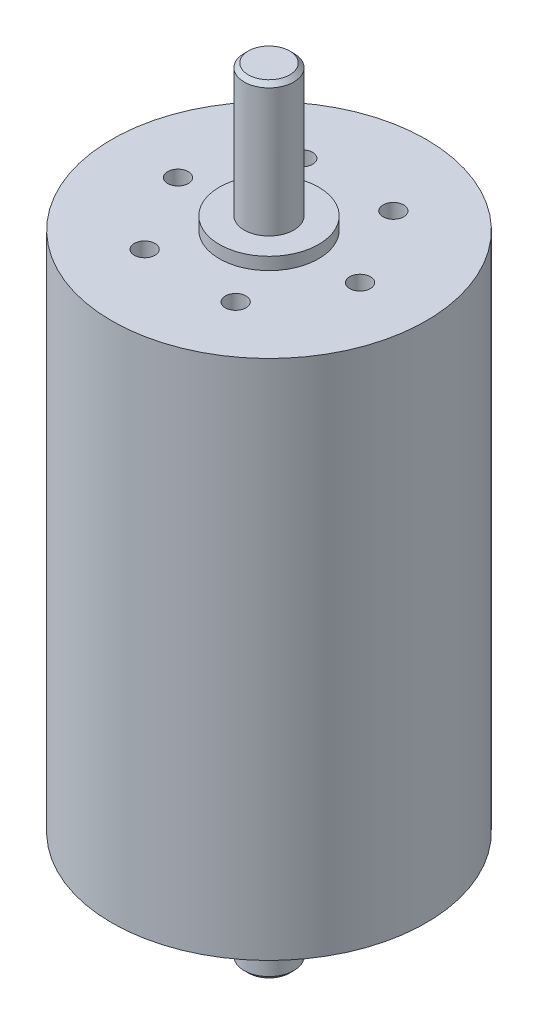
ISO-10303-21;
HEADER;
FILE_DESCRIPTION(('STEP AP214'),'2;1');
FILE_NAME('part.step','',(''),(''),'','','');
FILE_SCHEMA(('AUTOMOTIVE_DESIGN { 1 0 10303 214 1 1 1 1 }'));
ENDSEC;
DATA;
#1=APPLICATION_CONTEXT('core data for automotive mechanical design processes');
#2=APPLICATION_PROTOCOL_DEFINITION('international standard','automotive_design',2000,#1);
#3=PRODUCT_CONTEXT('',#1,'mechanical');
#4=PRODUCT('Part','Part','',(#3));
#5=PRODUCT_RELATED_PRODUCT_CATEGORY('part','',(#4));
#6=PRODUCT_DEFINITION_FORMATION('','',#4);
#7=PRODUCT_DEFINITION_CONTEXT('part definition',#1,'design');
#8=PRODUCT_DEFINITION('design','',#6,#7);
#9=PRODUCT_DEFINITION_SHAPE('','',#8);
#10=(LENGTH_UNIT() NAMED_UNIT(*) SI_UNIT(.MILLI.,.METRE.));
#11=(NAMED_UNIT(*) PLANE_ANGLE_UNIT() SI_UNIT($,.RADIAN.));
#12=(NAMED_UNIT(*) SI_UNIT($,.STERADIAN.) SOLID_ANGLE_UNIT());
#13=UNCERTAINTY_MEASURE_WITH_UNIT(LENGTH_MEASURE(1.E-05),#10,'distance_accuracy_value','');
#14=(GEOMETRIC_REPRESENTATION_CONTEXT(3) GLOBAL_UNCERTAINTY_ASSIGNED_CONTEXT((#13)) GLOBAL_UNIT_ASSIGNED_CONTEXT((#10,
#11,#12)) REPRESENTATION_CONTEXT('',''));
#15=CARTESIAN_POINT('',(0.,0.,0.));
#16=DIRECTION('',(0.,0.,1.));
#17=DIRECTION('',(1.,0.,0.));
#18=AXIS2_PLACEMENT_3D('',#15,#16,#17);
#19=CARTESIAN_POINT('',(3.,0.,0.));
#20=DIRECTION('',(0.,-1.,0.));
#21=DIRECTION('',(0.,0.,-1.));
#22=AXIS2_PLACEMENT_3D('',#19,#20,#21);
#23=PLANE('',#22);
#24=CARTESIAN_POINT('',(0.,0.,0.));
#25=DIRECTION('',(0.,-1.,0.));
#26=DIRECTION('',(0.,0.,-1.));
#27=AXIS2_PLACEMENT_3D('',#24,#25,#26);
#28=CIRCLE('',#27,2.5);
#29=CARTESIAN_POINT('',(0.,0.,-2.5));
#30=VERTEX_POINT('',#29);
#31=EDGE_CURVE('E40',#30,#30,#28,.T.);
#32=ORIENTED_EDGE('',*,*,#31,.T.);
#33=EDGE_LOOP('',(#32));
#34=FACE_BOUND('',#33,.T.);
#35=ADVANCED_FACE('F33',(#34),#23,.T.);
#36=CARTESIAN_POINT('',(0.,94.,0.));
#37=DIRECTION('',(0.,1.,0.));
#38=DIRECTION('',(0.,0.,1.));
#39=AXIS2_PLACEMENT_3D('',#36,#37,#38);
#40=PLANE('',#39);
#41=CARTESIAN_POINT('',(0.,94.,0.));
#42=DIRECTION('',(0.,1.,0.));
#43=DIRECTION('',(0.,0.,1.));
#44=AXIS2_PLACEMENT_3D('',#41,#42,#43);
#45=CIRCLE('',#44,2.49999999999996);
#46=CARTESIAN_POINT('',(0.,94.,2.49999999999996));
#47=VERTEX_POINT('',#46);
#48=EDGE_CURVE('E44',#47,#47,#45,.T.);
#49=ORIENTED_EDGE('',*,*,#48,.T.);
#50=EDGE_LOOP('',(#49));
#51=FACE_BOUND('',#50,.T.);
#52=ADVANCED_FACE('F215',(#51),#40,.T.);
#53=CARTESIAN_POINT('',(0.,0.,0.));
#54=DIRECTION('',(0.,-1.,0.));
#55=DIRECTION('',(0.,0.,-1.));
#56=AXIS2_PLACEMENT_3D('',#53,#54,#55);
#57=CYLINDRICAL_SURFACE('',#56,2.99999999999999);
#58=CARTESIAN_POINT('',(0.,93.5,0.));
#59=DIRECTION('',(0.,1.,0.));
#60=DIRECTION('',(0.,0.,1.));
#61=AXIS2_PLACEMENT_3D('',#58,#59,#60);
#62=CIRCLE('',#61,2.99999999999999);
#63=CARTESIAN_POINT('',(0.,93.5,2.99999999999999));
#64=VERTEX_POINT('',#63);
#65=EDGE_CURVE('E48',#64,#64,#62,.F.);
#66=ORIENTED_EDGE('',*,*,#65,.T.);
#67=EDGE_LOOP('',(#66));
#68=FACE_BOUND('',#67,.T.);
#69=CARTESIAN_POINT('',(0.,78.,0.));
#70=DIRECTION('',(0.,-1.,0.));
#71=DIRECTION('',(0.,0.,-1.));
#72=AXIS2_PLACEMENT_3D('',#69,#70,#71);
#73=CIRCLE('',#72,2.99999999999999);
#74=CARTESIAN_POINT('',(0.,78.,-2.99999999999999));
#75=VERTEX_POINT('',#74);
#76=EDGE_CURVE('E53',#75,#75,#73,.T.);
#77=ORIENTED_EDGE('',*,*,#76,.F.);
#78=EDGE_LOOP('',(#77));
#79=FACE_BOUND('',#78,.T.);
#80=ADVANCED_FACE('F220',(#68,#79),#57,.T.);
#81=CARTESIAN_POINT('',(2.99999999999999,78.,0.));
#82=DIRECTION('',(0.,1.,0.));
#83=DIRECTION('',(0.,0.,1.));
#84=AXIS2_PLACEMENT_3D('',#81,#82,#83);
#85=PLANE('',#84);
#86=ORIENTED_EDGE('',*,*,#76,.T.);
#87=EDGE_LOOP('',(#86));
#88=FACE_BOUND('',#87,.T.);
#89=CARTESIAN_POINT('',(0.,78.,0.));
#90=DIRECTION('',(0.,-1.,0.));
#91=DIRECTION('',(0.,0.,-1.));
#92=AXIS2_PLACEMENT_3D('',#89,#90,#91);
#93=CIRCLE('',#92,5.99999999999999);
#94=CARTESIAN_POINT('',(0.,78.,-5.99999999999999));
#95=VERTEX_POINT('',#94);
#96=EDGE_CURVE('E56',#95,#95,#93,.T.);
#97=ORIENTED_EDGE('',*,*,#96,.F.);
#98=EDGE_LOOP('',(#97));
#99=FACE_BOUND('',#98,.T.);
#100=ADVANCED_FACE('F239',(#88,#99),#85,.T.);
#101=CARTESIAN_POINT('',(0.,0.,0.));
#102=DIRECTION('',(0.,-1.,0.));
#103=DIRECTION('',(0.,0.,-1.));
#104=AXIS2_PLACEMENT_3D('',#101,#102,#103);
#105=CYLINDRICAL_SURFACE('',#104,5.99999999999999);
#106=ORIENTED_EDGE('',*,*,#96,.T.);
#107=EDGE_LOOP('',(#106));
#108=FACE_BOUND('',#107,.T.);
#109=CARTESIAN_POINT('',(0.,76.5,0.));
#110=DIRECTION('',(0.,-1.,0.));
#111=DIRECTION('',(0.,0.,-1.));
#112=AXIS2_PLACEMENT_3D('',#109,#110,#111);
#113=CIRCLE('',#112,5.99999999999999);
#114=CARTESIAN_POINT('',(0.,76.5,-5.99999999999999));
#115=VERTEX_POINT('',#114);
#116=EDGE_CURVE('E59',#115,#115,#113,.T.);
#117=ORIENTED_EDGE('',*,*,#116,.F.);
#118=EDGE_LOOP('',(#117));
#119=FACE_BOUND('',#118,.T.);
#120=ADVANCED_FACE('F163',(#108,#119),#105,.T.);
#121=CARTESIAN_POINT('',(5.99999999999999,76.5,0.));
#122=DIRECTION('',(0.,1.,0.));
#123=DIRECTION('',(0.,0.,1.));
#124=AXIS2_PLACEMENT_3D('',#121,#122,#123);
#125=PLANE('',#124);
#126=CARTESIAN_POINT('',(5.5,76.5,-9.52627944162882));
#127=DIRECTION('',(0.,1.,0.));
#128=DIRECTION('',(0.,0.,1.));
#129=AXIS2_PLACEMENT_3D('',#126,#127,#128);
#130=CIRCLE('',#129,1.25);
#131=CARTESIAN_POINT('',(5.5,76.5,-8.27627944162882));
#132=VERTEX_POINT('',#131);
#133=EDGE_CURVE('E144',#132,#132,#130,.T.);
#134=ORIENTED_EDGE('',*,*,#133,.F.);
#135=EDGE_LOOP('',(#134));
#136=FACE_BOUND('',#135,.T.);
#137=CARTESIAN_POINT('',(-5.5,76.5,-9.52627944162883));
#138=DIRECTION('',(0.,1.,0.));
#139=DIRECTION('',(0.,0.,1.));
#140=AXIS2_PLACEMENT_3D('',#137,#138,#139);
#141=CIRCLE('',#140,1.25);
#142=CARTESIAN_POINT('',(-5.5,76.5,-8.27627944162883));
#143=VERTEX_POINT('',#142);
#144=EDGE_CURVE('E138',#143,#143,#141,.T.);
#145=ORIENTED_EDGE('',*,*,#144,.F.);
#146=EDGE_LOOP('',(#145));
#147=FACE_BOUND('',#146,.T.);
#148=CARTESIAN_POINT('',(-11.,76.5,0.));
#149=DIRECTION('',(0.,1.,0.));
#150=DIRECTION('',(0.,0.,1.));
#151=AXIS2_PLACEMENT_3D('',#148,#149,#150);
#152=CIRCLE('',#151,1.25);
#153=CARTESIAN_POINT('',(-11.,76.5,1.25));
#154=VERTEX_POINT('',#153);
#155=EDGE_CURVE('E132',#154,#154,#152,.T.);
#156=ORIENTED_EDGE('',*,*,#155,.F.);
#157=EDGE_LOOP('',(#156));
#158=FACE_BOUND('',#157,.T.);
#159=CARTESIAN_POINT('',(-5.50000000000001,76.5,9.52627944162882));
#160=DIRECTION('',(0.,1.,0.));
#161=DIRECTION('',(0.,0.,1.));
#162=AXIS2_PLACEMENT_3D('',#159,#160,#161);
#163=CIRCLE('',#162,1.25);
#164=CARTESIAN_POINT('',(-5.50000000000001,76.5,10.7762794416288));
#165=VERTEX_POINT('',#164);
#166=EDGE_CURVE('E126',#165,#165,#163,.T.);
#167=ORIENTED_EDGE('',*,*,#166,.F.);
#168=EDGE_LOOP('',(#167));
#169=FACE_BOUND('',#168,.T.);
#170=CARTESIAN_POINT('',(5.49999999999999,76.5,9.52627944162883));
#171=DIRECTION('',(0.,1.,0.));
#172=DIRECTION('',(0.,0.,1.));
#173=AXIS2_PLACEMENT_3D('',#170,#171,#172);
#174=CIRCLE('',#173,1.25);
#175=CARTESIAN_POINT('',(5.49999999999999,76.5,10.7762794416288));
#176=VERTEX_POINT('',#175);
#177=EDGE_CURVE('E120',#176,#176,#174,.T.);
#178=ORIENTED_EDGE('',*,*,#177,.F.);
#179=EDGE_LOOP('',(#178));
#180=FACE_BOUND('',#179,.T.);
#181=CARTESIAN_POINT('',(11.,76.5,0.));
#182=DIRECTION('',(0.,1.,0.));
#183=DIRECTION('',(0.,0.,1.));
#184=AXIS2_PLACEMENT_3D('',#181,#182,#183);
#185=CIRCLE('',#184,1.25);
#186=CARTESIAN_POINT('',(11.,76.5,1.25));
#187=VERTEX_POINT('',#186);
#188=EDGE_CURVE('E114',#187,#187,#185,.T.);
#189=ORIENTED_EDGE('',*,*,#188,.F.);
#190=EDGE_LOOP('',(#189));
#191=FACE_BOUND('',#190,.T.);
#192=ORIENTED_EDGE('',*,*,#116,.T.);
#193=EDGE_LOOP('',(#192));
#194=FACE_BOUND('',#193,.T.);
#195=CARTESIAN_POINT('',(0.,76.5,0.));
#196=DIRECTION('',(0.,-1.,0.));
#197=DIRECTION('',(0.,0.,-1.));
#198=AXIS2_PLACEMENT_3D('',#195,#196,#197);
#199=CIRCLE('',#198,19.);
#200=CARTESIAN_POINT('',(0.,76.5,-19.));
#201=VERTEX_POINT('',#200);
#202=EDGE_CURVE('E62',#201,#201,#199,.T.);
#203=ORIENTED_EDGE('',*,*,#202,.F.);
#204=EDGE_LOOP('',(#203));
#205=FACE_BOUND('',#204,.T.);
#206=ADVANCED_FACE('F159',(#136,#147,#158,#169,#180,#191,#194,#205),#125,.T.);
#207=CARTESIAN_POINT('',(0.,0.,0.));
#208=DIRECTION('',(0.,-1.,0.));
#209=DIRECTION('',(0.,0.,-1.));
#210=AXIS2_PLACEMENT_3D('',#207,#208,#209);
#211=CYLINDRICAL_SURFACE('',#210,19.);
#212=ORIENTED_EDGE('',*,*,#202,.T.);
#213=EDGE_LOOP('',(#212));
#214=FACE_BOUND('',#213,.T.);
#215=CARTESIAN_POINT('',(0.,13.5,0.));
#216=DIRECTION('',(0.,-1.,0.));
#217=DIRECTION('',(0.,0.,-1.));
#218=AXIS2_PLACEMENT_3D('',#215,#216,#217);
#219=CIRCLE('',#218,19.);
#220=CARTESIAN_POINT('',(0.,13.5,-19.));
#221=VERTEX_POINT('',#220);
#222=EDGE_CURVE('E65',#221,#221,#219,.T.);
#223=ORIENTED_EDGE('',*,*,#222,.F.);
#224=EDGE_LOOP('',(#223));
#225=FACE_BOUND('',#224,.T.);
#226=ADVANCED_FACE('F162',(#214,#225),#211,.T.);
#227=CARTESIAN_POINT('',(19.,13.5,0.));
#228=DIRECTION('',(0.,-1.,0.));
#229=DIRECTION('',(0.,0.,-1.));
#230=AXIS2_PLACEMENT_3D('',#227,#228,#229);
#231=PLANE('',#230);
#232=CARTESIAN_POINT('',(5.5,13.5,-9.52627944162882));
#233=DIRECTION('',(0.,-1.,0.));
#234=DIRECTION('',(0.,0.,-1.));
#235=AXIS2_PLACEMENT_3D('',#232,#233,#234);
#236=CIRCLE('',#235,1.25);
#237=CARTESIAN_POINT('',(5.5,13.5,-10.7762794416288));
#238=VERTEX_POINT('',#237);
#239=EDGE_CURVE('E109',#238,#238,#236,.T.);
#240=ORIENTED_EDGE('',*,*,#239,.F.);
#241=EDGE_LOOP('',(#240));
#242=FACE_BOUND('',#241,.T.);
#243=CARTESIAN_POINT('',(-5.5,13.5,-9.52627944162883));
#244=DIRECTION('',(0.,-1.,0.));
#245=DIRECTION('',(0.,0.,-1.));
#246=AXIS2_PLACEMENT_3D('',#243,#244,#245);
#247=CIRCLE('',#246,1.25);
#248=CARTESIAN_POINT('',(-5.5,13.5,-10.7762794416288));
#249=VERTEX_POINT('',#248);
#250=EDGE_CURVE('E103',#249,#249,#247,.T.);
#251=ORIENTED_EDGE('',*,*,#250,.F.);
#252=EDGE_LOOP('',(#251));
#253=FACE_BOUND('',#252,.T.);
#254=CARTESIAN_POINT('',(-11.,13.5,0.));
#255=DIRECTION('',(0.,-1.,0.));
#256=DIRECTION('',(0.,0.,-1.));
#257=AXIS2_PLACEMENT_3D('',#254,#255,#256);
#258=CIRCLE('',#257,1.25);
#259=CARTESIAN_POINT('',(-11.,13.5,-1.25));
#260=VERTEX_POINT('',#259);
#261=EDGE_CURVE('E97',#260,#260,#258,.T.);
#262=ORIENTED_EDGE('',*,*,#261,.F.);
#263=EDGE_LOOP('',(#262));
#264=FACE_BOUND('',#263,.T.);
#265=CARTESIAN_POINT('',(-5.50000000000001,13.5,9.52627944162882));
#266=DIRECTION('',(0.,-1.,0.));
#267=DIRECTION('',(0.,0.,-1.));
#268=AXIS2_PLACEMENT_3D('',#265,#266,#267);
#269=CIRCLE('',#268,1.25);
#270=CARTESIAN_POINT('',(-5.50000000000001,13.5,8.27627944162882));
#271=VERTEX_POINT('',#270);
#272=EDGE_CURVE('E91',#271,#271,#269,.T.);
#273=ORIENTED_EDGE('',*,*,#272,.F.);
#274=EDGE_LOOP('',(#273));
#275=FACE_BOUND('',#274,.T.);
#276=CARTESIAN_POINT('',(5.49999999999999,13.5,9.52627944162883));
#277=DIRECTION('',(0.,-1.,0.));
#278=DIRECTION('',(0.,0.,-1.));
#279=AXIS2_PLACEMENT_3D('',#276,#277,#278);
#280=CIRCLE('',#279,1.25);
#281=CARTESIAN_POINT('',(5.49999999999999,13.5,8.27627944162883));
#282=VERTEX_POINT('',#281);
#283=EDGE_CURVE('E84',#282,#282,#280,.T.);
#284=ORIENTED_EDGE('',*,*,#283,.F.);
#285=EDGE_LOOP('',(#284));
#286=FACE_BOUND('',#285,.T.);
#287=CARTESIAN_POINT('',(11.,13.5,0.));
#288=DIRECTION('',(0.,-1.,0.));
#289=DIRECTION('',(0.,0.,-1.));
#290=AXIS2_PLACEMENT_3D('',#287,#288,#289);
#291=CIRCLE('',#290,1.25);
#292=CARTESIAN_POINT('',(11.,13.5,-1.25));
#293=VERTEX_POINT('',#292);
#294=EDGE_CURVE('E78',#293,#293,#291,.T.);
#295=ORIENTED_EDGE('',*,*,#294,.F.);
#296=EDGE_LOOP('',(#295));
#297=FACE_BOUND('',#296,.T.);
#298=ORIENTED_EDGE('',*,*,#222,.T.);
#299=EDGE_LOOP('',(#298));
#300=FACE_BOUND('',#299,.T.);
#301=CARTESIAN_POINT('',(0.,13.5,0.));
#302=DIRECTION('',(0.,-1.,0.));
#303=DIRECTION('',(0.,0.,-1.));
#304=AXIS2_PLACEMENT_3D('',#301,#302,#303);
#305=CIRCLE('',#304,6.);
#306=CARTESIAN_POINT('',(0.,13.5,-6.));
#307=VERTEX_POINT('',#306);
#308=EDGE_CURVE('E68',#307,#307,#305,.T.);
#309=ORIENTED_EDGE('',*,*,#308,.F.);
#310=EDGE_LOOP('',(#309));
#311=FACE_BOUND('',#310,.T.);
#312=ADVANCED_FACE('F181',(#242,#253,#264,#275,#286,#297,#300,#311),#231,.T.);
#313=CARTESIAN_POINT('',(0.,0.,0.));
#314=DIRECTION('',(0.,-1.,0.));
#315=DIRECTION('',(0.,0.,-1.));
#316=AXIS2_PLACEMENT_3D('',#313,#314,#315);
#317=CYLINDRICAL_SURFACE('',#316,6.);
#318=ORIENTED_EDGE('',*,*,#308,.T.);
#319=EDGE_LOOP('',(#318));
#320=FACE_BOUND('',#319,.T.);
#321=CARTESIAN_POINT('',(0.,12.,0.));
#322=DIRECTION('',(0.,-1.,0.));
#323=DIRECTION('',(0.,0.,-1.));
#324=AXIS2_PLACEMENT_3D('',#321,#322,#323);
#325=CIRCLE('',#324,6.);
#326=CARTESIAN_POINT('',(0.,12.,-6.));
#327=VERTEX_POINT('',#326);
#328=EDGE_CURVE('E71',#327,#327,#325,.T.);
#329=ORIENTED_EDGE('',*,*,#328,.F.);
#330=EDGE_LOOP('',(#329));
#331=FACE_BOUND('',#330,.T.);
#332=ADVANCED_FACE('F187',(#320,#331),#317,.T.);
#333=CARTESIAN_POINT('',(6.,12.,0.));
#334=DIRECTION('',(0.,-1.,0.));
#335=DIRECTION('',(0.,0.,-1.));
#336=AXIS2_PLACEMENT_3D('',#333,#334,#335);
#337=PLANE('',#336);
#338=ORIENTED_EDGE('',*,*,#328,.T.);
#339=EDGE_LOOP('',(#338));
#340=FACE_BOUND('',#339,.T.);
#341=CARTESIAN_POINT('',(0.,12.,0.));
#342=DIRECTION('',(0.,-1.,0.));
#343=DIRECTION('',(0.,0.,-1.));
#344=AXIS2_PLACEMENT_3D('',#341,#342,#343);
#345=CIRCLE('',#344,3.);
#346=CARTESIAN_POINT('',(0.,12.,-3.));
#347=VERTEX_POINT('',#346);
#348=EDGE_CURVE('E74',#347,#347,#345,.T.);
#349=ORIENTED_EDGE('',*,*,#348,.F.);
#350=EDGE_LOOP('',(#349));
#351=FACE_BOUND('',#350,.T.);
#352=ADVANCED_FACE('F194',(#340,#351),#337,.T.);
#353=CARTESIAN_POINT('',(0.,0.,0.));
#354=DIRECTION('',(0.,-1.,0.));
#355=DIRECTION('',(0.,0.,-1.));
#356=AXIS2_PLACEMENT_3D('',#353,#354,#355);
#357=CYLINDRICAL_SURFACE('',#356,3.);
#358=CARTESIAN_POINT('',(0.,0.500000000000009,0.));
#359=DIRECTION('',(0.,-1.,0.));
#360=DIRECTION('',(0.,0.,-1.));
#361=AXIS2_PLACEMENT_3D('',#358,#359,#360);
#362=CIRCLE('',#361,3.);
#363=CARTESIAN_POINT('',(0.,0.500000000000009,-3.));
#364=VERTEX_POINT('',#363);
#365=EDGE_CURVE('E10',#364,#364,#362,.F.);
#366=ORIENTED_EDGE('',*,*,#365,.T.);
#367=EDGE_LOOP('',(#366));
#368=FACE_BOUND('',#367,.T.);
#369=ORIENTED_EDGE('',*,*,#348,.T.);
#370=EDGE_LOOP('',(#369));
#371=FACE_BOUND('',#370,.T.);
#372=ADVANCED_FACE('F200',(#368,#371),#357,.T.);
#373=CARTESIAN_POINT('',(11.,16.5,0.));
#374=DIRECTION('',(0.,-1.,0.));
#375=DIRECTION('',(0.,0.,-1.));
#376=AXIS2_PLACEMENT_3D('',#373,#374,#375);
#377=CYLINDRICAL_SURFACE('',#376,1.25);
#378=CARTESIAN_POINT('',(11.,16.5,0.));
#379=DIRECTION('',(0.,-1.,0.));
#380=DIRECTION('',(0.,0.,-1.));
#381=AXIS2_PLACEMENT_3D('',#378,#379,#380);
#382=CIRCLE('',#381,1.25);
#383=CARTESIAN_POINT('',(11.,16.5,-1.25));
#384=VERTEX_POINT('',#383);
#385=EDGE_CURVE('E77',#384,#384,#382,.T.);
#386=ORIENTED_EDGE('',*,*,#385,.F.);
#387=EDGE_LOOP('',(#386));
#388=FACE_BOUND('',#387,.T.);
#389=ORIENTED_EDGE('',*,*,#294,.T.);
#390=EDGE_LOOP('',(#389));
#391=FACE_BOUND('',#390,.T.);
#392=ADVANCED_FACE('F205',(#388,#391),#377,.F.);
#393=CARTESIAN_POINT('',(11.,16.5,0.));
#394=DIRECTION('',(0.,-1.,0.));
#395=DIRECTION('',(0.,0.,-1.));
#396=AXIS2_PLACEMENT_3D('',#393,#394,#395);
#397=PLANE('',#396);
#398=ORIENTED_EDGE('',*,*,#385,.T.);
#399=EDGE_LOOP('',(#398));
#400=FACE_BOUND('',#399,.T.);
#401=ADVANCED_FACE('F212',(#400),#397,.T.);
#402=CARTESIAN_POINT('',(5.49999999999999,16.5,9.52627944162883));
#403=DIRECTION('',(0.,-1.,0.));
#404=DIRECTION('',(0.,0.,-1.));
#405=AXIS2_PLACEMENT_3D('',#402,#403,#404);
#406=CYLINDRICAL_SURFACE('',#405,1.25);
#407=CARTESIAN_POINT('',(5.49999999999999,16.5,9.52627944162883));
#408=DIRECTION('',(0.,-1.,0.));
#409=DIRECTION('',(0.,0.,-1.));
#410=AXIS2_PLACEMENT_3D('',#407,#408,#409);
#411=CIRCLE('',#410,1.25);
#412=CARTESIAN_POINT('',(5.49999999999999,16.5,8.27627944162883));
#413=VERTEX_POINT('',#412);
#414=EDGE_CURVE('E87',#413,#413,#411,.T.);
#415=ORIENTED_EDGE('',*,*,#414,.F.);
#416=EDGE_LOOP('',(#415));
#417=FACE_BOUND('',#416,.T.);
#418=ORIENTED_EDGE('',*,*,#283,.T.);
#419=EDGE_LOOP('',(#418));
#420=FACE_BOUND('',#419,.T.);
#421=ADVANCED_FACE('F300',(#417,#420),#406,.F.);
#422=CARTESIAN_POINT('',(5.49999999999999,16.5,9.52627944162883));
#423=DIRECTION('',(0.,-1.,0.));
#424=DIRECTION('',(0.,0.,-1.));
#425=AXIS2_PLACEMENT_3D('',#422,#423,#424);
#426=PLANE('',#425);
#427=ORIENTED_EDGE('',*,*,#414,.T.);
#428=EDGE_LOOP('',(#427));
#429=FACE_BOUND('',#428,.T.);
#430=ADVANCED_FACE('F308',(#429),#426,.T.);
#431=CARTESIAN_POINT('',(-5.50000000000001,16.5,9.52627944162882));
#432=DIRECTION('',(0.,-1.,0.));
#433=DIRECTION('',(0.,0.,-1.));
#434=AXIS2_PLACEMENT_3D('',#431,#432,#433);
#435=CYLINDRICAL_SURFACE('',#434,1.25);
#436=CARTESIAN_POINT('',(-5.50000000000001,16.5,9.52627944162882));
#437=DIRECTION('',(0.,-1.,0.));
#438=DIRECTION('',(0.,0.,-1.));
#439=AXIS2_PLACEMENT_3D('',#436,#437,#438);
#440=CIRCLE('',#439,1.25);
#441=CARTESIAN_POINT('',(-5.50000000000001,16.5,8.27627944162882));
#442=VERTEX_POINT('',#441);
#443=EDGE_CURVE('E94',#442,#442,#440,.T.);
#444=ORIENTED_EDGE('',*,*,#443,.F.);
#445=EDGE_LOOP('',(#444));
#446=FACE_BOUND('',#445,.T.);
#447=ORIENTED_EDGE('',*,*,#272,.T.);
#448=EDGE_LOOP('',(#447));
#449=FACE_BOUND('',#448,.T.);
#450=ADVANCED_FACE('F316',(#446,#449),#435,.F.);
#451=CARTESIAN_POINT('',(-5.50000000000001,16.5,9.52627944162882));
#452=DIRECTION('',(0.,-1.,0.));
#453=DIRECTION('',(0.,0.,-1.));
#454=AXIS2_PLACEMENT_3D('',#451,#452,#453);
#455=PLANE('',#454);
#456=ORIENTED_EDGE('',*,*,#443,.T.);
#457=EDGE_LOOP('',(#456));
#458=FACE_BOUND('',#457,.T.);
#459=ADVANCED_FACE('F324',(#458),#455,.T.);
#460=CARTESIAN_POINT('',(-11.,16.5,0.));
#461=DIRECTION('',(0.,-1.,0.));
#462=DIRECTION('',(0.,0.,-1.));
#463=AXIS2_PLACEMENT_3D('',#460,#461,#462);
#464=CYLINDRICAL_SURFACE('',#463,1.25);
#465=CARTESIAN_POINT('',(-11.,16.5,0.));
#466=DIRECTION('',(0.,-1.,0.));
#467=DIRECTION('',(0.,0.,-1.));
#468=AXIS2_PLACEMENT_3D('',#465,#466,#467);
#469=CIRCLE('',#468,1.25);
#470=CARTESIAN_POINT('',(-11.,16.5,-1.25));
#471=VERTEX_POINT('',#470);
#472=EDGE_CURVE('E100',#471,#471,#469,.T.);
#473=ORIENTED_EDGE('',*,*,#472,.F.);
#474=EDGE_LOOP('',(#473));
#475=FACE_BOUND('',#474,.T.);
#476=ORIENTED_EDGE('',*,*,#261,.T.);
#477=EDGE_LOOP('',(#476));
#478=FACE_BOUND('',#477,.T.);
#479=ADVANCED_FACE('F332',(#475,#478),#464,.F.);
#480=CARTESIAN_POINT('',(-11.,16.5,0.));
#481=DIRECTION('',(0.,-1.,0.));
#482=DIRECTION('',(0.,0.,-1.));
#483=AXIS2_PLACEMENT_3D('',#480,#481,#482);
#484=PLANE('',#483);
#485=ORIENTED_EDGE('',*,*,#472,.T.);
#486=EDGE_LOOP('',(#485));
#487=FACE_BOUND('',#486,.T.);
#488=ADVANCED_FACE('F340',(#487),#484,.T.);
#489=CARTESIAN_POINT('',(-5.5,16.5,-9.52627944162883));
#490=DIRECTION('',(0.,-1.,0.));
#491=DIRECTION('',(0.,0.,-1.));
#492=AXIS2_PLACEMENT_3D('',#489,#490,#491);
#493=CYLINDRICAL_SURFACE('',#492,1.25);
#494=CARTESIAN_POINT('',(-5.5,16.5,-9.52627944162883));
#495=DIRECTION('',(0.,-1.,0.));
#496=DIRECTION('',(0.,0.,-1.));
#497=AXIS2_PLACEMENT_3D('',#494,#495,#496);
#498=CIRCLE('',#497,1.25);
#499=CARTESIAN_POINT('',(-5.5,16.5,-10.7762794416288));
#500=VERTEX_POINT('',#499);
#501=EDGE_CURVE('E106',#500,#500,#498,.T.);
#502=ORIENTED_EDGE('',*,*,#501,.F.);
#503=EDGE_LOOP('',(#502));
#504=FACE_BOUND('',#503,.T.);
#505=ORIENTED_EDGE('',*,*,#250,.T.);
#506=EDGE_LOOP('',(#505));
#507=FACE_BOUND('',#506,.T.);
#508=ADVANCED_FACE('F348',(#504,#507),#493,.F.);
#509=CARTESIAN_POINT('',(-5.5,16.5,-9.52627944162883));
#510=DIRECTION('',(0.,-1.,0.));
#511=DIRECTION('',(0.,0.,-1.));
#512=AXIS2_PLACEMENT_3D('',#509,#510,#511);
#513=PLANE('',#512);
#514=ORIENTED_EDGE('',*,*,#501,.T.);
#515=EDGE_LOOP('',(#514));
#516=FACE_BOUND('',#515,.T.);
#517=ADVANCED_FACE('F356',(#516),#513,.T.);
#518=CARTESIAN_POINT('',(5.5,16.5,-9.52627944162882));
#519=DIRECTION('',(0.,-1.,0.));
#520=DIRECTION('',(0.,0.,-1.));
#521=AXIS2_PLACEMENT_3D('',#518,#519,#520);
#522=CYLINDRICAL_SURFACE('',#521,1.25);
#523=CARTESIAN_POINT('',(5.5,16.5,-9.52627944162882));
#524=DIRECTION('',(0.,-1.,0.));
#525=DIRECTION('',(0.,0.,-1.));
#526=AXIS2_PLACEMENT_3D('',#523,#524,#525);
#527=CIRCLE('',#526,1.25);
#528=CARTESIAN_POINT('',(5.5,16.5,-10.7762794416288));
#529=VERTEX_POINT('',#528);
#530=EDGE_CURVE('E81',#529,#529,#527,.T.);
#531=ORIENTED_EDGE('',*,*,#530,.F.);
#532=EDGE_LOOP('',(#531));
#533=FACE_BOUND('',#532,.T.);
#534=ORIENTED_EDGE('',*,*,#239,.T.);
#535=EDGE_LOOP('',(#534));
#536=FACE_BOUND('',#535,.T.);
#537=ADVANCED_FACE('F364',(#533,#536),#522,.F.);
#538=CARTESIAN_POINT('',(5.5,16.5,-9.52627944162882));
#539=DIRECTION('',(0.,-1.,0.));
#540=DIRECTION('',(0.,0.,-1.));
#541=AXIS2_PLACEMENT_3D('',#538,#539,#540);
#542=PLANE('',#541);
#543=ORIENTED_EDGE('',*,*,#530,.T.);
#544=EDGE_LOOP('',(#543));
#545=FACE_BOUND('',#544,.T.);
#546=ADVANCED_FACE('F372',(#545),#542,.T.);
#547=CARTESIAN_POINT('',(11.,73.5,0.));
#548=DIRECTION('',(0.,1.,0.));
#549=DIRECTION('',(0.,0.,1.));
#550=AXIS2_PLACEMENT_3D('',#547,#548,#549);
#551=CYLINDRICAL_SURFACE('',#550,1.25);
#552=CARTESIAN_POINT('',(11.,73.5,0.));
#553=DIRECTION('',(0.,1.,0.));
#554=DIRECTION('',(0.,0.,1.));
#555=AXIS2_PLACEMENT_3D('',#552,#553,#554);
#556=CIRCLE('',#555,1.25);
#557=CARTESIAN_POINT('',(11.,73.5,1.25));
#558=VERTEX_POINT('',#557);
#559=EDGE_CURVE('E88',#558,#558,#556,.T.);
#560=ORIENTED_EDGE('',*,*,#559,.F.);
#561=EDGE_LOOP('',(#560));
#562=FACE_BOUND('',#561,.T.);
#563=ORIENTED_EDGE('',*,*,#188,.T.);
#564=EDGE_LOOP('',(#563));
#565=FACE_BOUND('',#564,.T.);
#566=ADVANCED_FACE('F379',(#562,#565),#551,.F.);
#567=CARTESIAN_POINT('',(11.,73.5,0.));
#568=DIRECTION('',(0.,1.,0.));
#569=DIRECTION('',(0.,0.,1.));
#570=AXIS2_PLACEMENT_3D('',#567,#568,#569);
#571=PLANE('',#570);
#572=ORIENTED_EDGE('',*,*,#559,.T.);
#573=EDGE_LOOP('',(#572));
#574=FACE_BOUND('',#573,.T.);
#575=ADVANCED_FACE('F386',(#574),#571,.T.);
#576=CARTESIAN_POINT('',(5.49999999999999,73.5,9.52627944162883));
#577=DIRECTION('',(0.,1.,0.));
#578=DIRECTION('',(0.,0.,1.));
#579=AXIS2_PLACEMENT_3D('',#576,#577,#578);
#580=CYLINDRICAL_SURFACE('',#579,1.25);
#581=CARTESIAN_POINT('',(5.49999999999999,73.5,9.52627944162883));
#582=DIRECTION('',(0.,1.,0.));
#583=DIRECTION('',(0.,0.,1.));
#584=AXIS2_PLACEMENT_3D('',#581,#582,#583);
#585=CIRCLE('',#584,1.25);
#586=CARTESIAN_POINT('',(5.49999999999999,73.5,10.7762794416288));
#587=VERTEX_POINT('',#586);
#588=EDGE_CURVE('E123',#587,#587,#585,.T.);
#589=ORIENTED_EDGE('',*,*,#588,.F.);
#590=EDGE_LOOP('',(#589));
#591=FACE_BOUND('',#590,.T.);
#592=ORIENTED_EDGE('',*,*,#177,.T.);
#593=EDGE_LOOP('',(#592));
#594=FACE_BOUND('',#593,.T.);
#595=ADVANCED_FACE('F394',(#591,#594),#580,.F.);
#596=CARTESIAN_POINT('',(5.49999999999999,73.5,9.52627944162883));
#597=DIRECTION('',(0.,1.,0.));
#598=DIRECTION('',(0.,0.,1.));
#599=AXIS2_PLACEMENT_3D('',#596,#597,#598);
#600=PLANE('',#599);
#601=ORIENTED_EDGE('',*,*,#588,.T.);
#602=EDGE_LOOP('',(#601));
#603=FACE_BOUND('',#602,.T.);
#604=ADVANCED_FACE('F402',(#603),#600,.T.);
#605=CARTESIAN_POINT('',(-5.50000000000001,73.5,9.52627944162882));
#606=DIRECTION('',(0.,1.,0.));
#607=DIRECTION('',(0.,0.,1.));
#608=AXIS2_PLACEMENT_3D('',#605,#606,#607);
#609=CYLINDRICAL_SURFACE('',#608,1.25);
#610=CARTESIAN_POINT('',(-5.50000000000001,73.5,9.52627944162882));
#611=DIRECTION('',(0.,1.,0.));
#612=DIRECTION('',(0.,0.,1.));
#613=AXIS2_PLACEMENT_3D('',#610,#611,#612);
#614=CIRCLE('',#613,1.25);
#615=CARTESIAN_POINT('',(-5.50000000000001,73.5,10.7762794416288));
#616=VERTEX_POINT('',#615);
#617=EDGE_CURVE('E129',#616,#616,#614,.T.);
#618=ORIENTED_EDGE('',*,*,#617,.F.);
#619=EDGE_LOOP('',(#618));
#620=FACE_BOUND('',#619,.T.);
#621=ORIENTED_EDGE('',*,*,#166,.T.);
#622=EDGE_LOOP('',(#621));
#623=FACE_BOUND('',#622,.T.);
#624=ADVANCED_FACE('F410',(#620,#623),#609,.F.);
#625=CARTESIAN_POINT('',(-5.50000000000001,73.5,9.52627944162882));
#626=DIRECTION('',(0.,1.,0.));
#627=DIRECTION('',(0.,0.,1.));
#628=AXIS2_PLACEMENT_3D('',#625,#626,#627);
#629=PLANE('',#628);
#630=ORIENTED_EDGE('',*,*,#617,.T.);
#631=EDGE_LOOP('',(#630));
#632=FACE_BOUND('',#631,.T.);
#633=ADVANCED_FACE('F418',(#632),#629,.T.);
#634=CARTESIAN_POINT('',(-11.,73.5,0.));
#635=DIRECTION('',(0.,1.,0.));
#636=DIRECTION('',(0.,0.,1.));
#637=AXIS2_PLACEMENT_3D('',#634,#635,#636);
#638=CYLINDRICAL_SURFACE('',#637,1.25);
#639=CARTESIAN_POINT('',(-11.,73.5,0.));
#640=DIRECTION('',(0.,1.,0.));
#641=DIRECTION('',(0.,0.,1.));
#642=AXIS2_PLACEMENT_3D('',#639,#640,#641);
#643=CIRCLE('',#642,1.25);
#644=CARTESIAN_POINT('',(-11.,73.5,1.25));
#645=VERTEX_POINT('',#644);
#646=EDGE_CURVE('E135',#645,#645,#643,.T.);
#647=ORIENTED_EDGE('',*,*,#646,.F.);
#648=EDGE_LOOP('',(#647));
#649=FACE_BOUND('',#648,.T.);
#650=ORIENTED_EDGE('',*,*,#155,.T.);
#651=EDGE_LOOP('',(#650));
#652=FACE_BOUND('',#651,.T.);
#653=ADVANCED_FACE('F426',(#649,#652),#638,.F.);
#654=CARTESIAN_POINT('',(-11.,73.5,0.));
#655=DIRECTION('',(0.,1.,0.));
#656=DIRECTION('',(0.,0.,1.));
#657=AXIS2_PLACEMENT_3D('',#654,#655,#656);
#658=PLANE('',#657);
#659=ORIENTED_EDGE('',*,*,#646,.T.);
#660=EDGE_LOOP('',(#659));
#661=FACE_BOUND('',#660,.T.);
#662=ADVANCED_FACE('F434',(#661),#658,.T.);
#663=CARTESIAN_POINT('',(-5.5,73.5,-9.52627944162883));
#664=DIRECTION('',(0.,1.,0.));
#665=DIRECTION('',(0.,0.,1.));
#666=AXIS2_PLACEMENT_3D('',#663,#664,#665);
#667=CYLINDRICAL_SURFACE('',#666,1.25);
#668=CARTESIAN_POINT('',(-5.5,73.5,-9.52627944162883));
#669=DIRECTION('',(0.,1.,0.));
#670=DIRECTION('',(0.,0.,1.));
#671=AXIS2_PLACEMENT_3D('',#668,#669,#670);
#672=CIRCLE('',#671,1.25);
#673=CARTESIAN_POINT('',(-5.5,73.5,-8.27627944162883));
#674=VERTEX_POINT('',#673);
#675=EDGE_CURVE('E141',#674,#674,#672,.T.);
#676=ORIENTED_EDGE('',*,*,#675,.F.);
#677=EDGE_LOOP('',(#676));
#678=FACE_BOUND('',#677,.T.);
#679=ORIENTED_EDGE('',*,*,#144,.T.);
#680=EDGE_LOOP('',(#679));
#681=FACE_BOUND('',#680,.T.);
#682=ADVANCED_FACE('F442',(#678,#681),#667,.F.);
#683=CARTESIAN_POINT('',(-5.5,73.5,-9.52627944162883));
#684=DIRECTION('',(0.,1.,0.));
#685=DIRECTION('',(0.,0.,1.));
#686=AXIS2_PLACEMENT_3D('',#683,#684,#685);
#687=PLANE('',#686);
#688=ORIENTED_EDGE('',*,*,#675,.T.);
#689=EDGE_LOOP('',(#688));
#690=FACE_BOUND('',#689,.T.);
#691=ADVANCED_FACE('F155',(#690),#687,.T.);
#692=CARTESIAN_POINT('',(5.5,73.5,-9.52627944162882));
#693=DIRECTION('',(0.,1.,0.));
#694=DIRECTION('',(0.,0.,1.));
#695=AXIS2_PLACEMENT_3D('',#692,#693,#694);
#696=CYLINDRICAL_SURFACE('',#695,1.25);
#697=CARTESIAN_POINT('',(5.5,73.5,-9.52627944162882));
#698=DIRECTION('',(0.,1.,0.));
#699=DIRECTION('',(0.,0.,1.));
#700=AXIS2_PLACEMENT_3D('',#697,#698,#699);
#701=CIRCLE('',#700,1.25);
#702=CARTESIAN_POINT('',(5.5,73.5,-8.27627944162882));
#703=VERTEX_POINT('',#702);
#704=EDGE_CURVE('E117',#703,#703,#701,.T.);
#705=ORIENTED_EDGE('',*,*,#704,.F.);
#706=EDGE_LOOP('',(#705));
#707=FACE_BOUND('',#706,.T.);
#708=ORIENTED_EDGE('',*,*,#133,.T.);
#709=EDGE_LOOP('',(#708));
#710=FACE_BOUND('',#709,.T.);
#711=ADVANCED_FACE('F152',(#707,#710),#696,.F.);
#712=CARTESIAN_POINT('',(5.5,73.5,-9.52627944162882));
#713=DIRECTION('',(0.,1.,0.));
#714=DIRECTION('',(0.,0.,1.));
#715=AXIS2_PLACEMENT_3D('',#712,#713,#714);
#716=PLANE('',#715);
#717=ORIENTED_EDGE('',*,*,#704,.T.);
#718=EDGE_LOOP('',(#717));
#719=FACE_BOUND('',#718,.T.);
#720=ADVANCED_FACE('F150',(#719),#716,.T.);
#721=CARTESIAN_POINT('',(0.,93.5,0.));
#722=DIRECTION('',(0.,-1.,0.));
#723=DIRECTION('',(0.,0.,-1.));
#724=AXIS2_PLACEMENT_3D('',#721,#722,#723);
#725=CONICAL_SURFACE('',#724,2.99999999999999,0.78539816339745);
#726=ORIENTED_EDGE('',*,*,#48,.F.);
#727=EDGE_LOOP('',(#726));
#728=FACE_BOUND('',#727,.T.);
#729=ORIENTED_EDGE('',*,*,#65,.F.);
#730=EDGE_LOOP('',(#729));
#731=FACE_BOUND('',#730,.T.);
#732=ADVANCED_FACE('F224',(#728,#731),#725,.T.);
#733=CARTESIAN_POINT('',(0.,0.,0.));
#734=DIRECTION('',(0.,1.,0.));
#735=DIRECTION('',(0.,0.,1.));
#736=AXIS2_PLACEMENT_3D('',#733,#734,#735);
#737=CONICAL_SURFACE('',#736,2.5,0.785398163397438);
#738=ORIENTED_EDGE('',*,*,#365,.F.);
#739=EDGE_LOOP('',(#738));
#740=FACE_BOUND('',#739,.T.);
#741=ORIENTED_EDGE('',*,*,#31,.F.);
#742=EDGE_LOOP('',(#741));
#743=FACE_BOUND('',#742,.T.);
#744=ADVANCED_FACE('F35',(#740,#743),#737,.T.);
#745=CLOSED_SHELL('',(#35,#52,#80,#100,#120,#206,#226,#312,#332,#352,#372,#392,#401,#421,#430,
#450,#459,#479,#488,#508,#517,#537,#546,#566,#575,#595,#604,#624,#633,#653,#662,#682,#691,#711,
#720,#732,#744));
#746=MANIFOLD_SOLID_BREP('B2',#745);
#747=ADVANCED_BREP_SHAPE_REPRESENTATION('',(#18,#746),#14);
#748=SHAPE_DEFINITION_REPRESENTATION(#9,#747);
ENDSEC;
END-ISO-10303-21;
